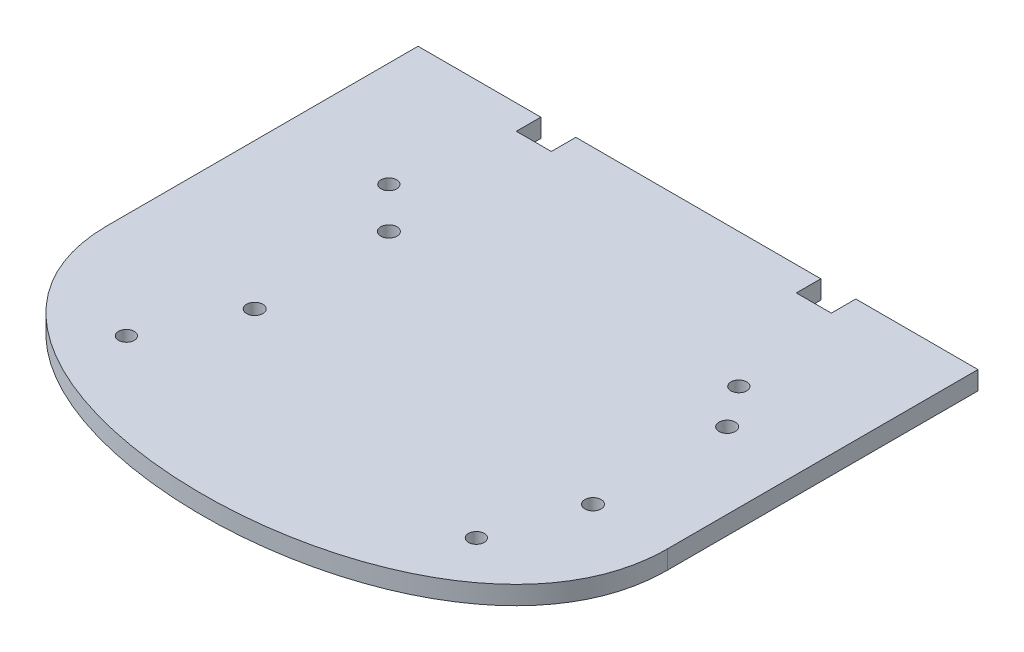
ISO-10303-21;
HEADER;
FILE_DESCRIPTION(('STEP AP214'),'2;1');
FILE_NAME('part.step','',(''),(''),'','','');
FILE_SCHEMA(('AUTOMOTIVE_DESIGN { 1 0 10303 214 1 1 1 1 }'));
ENDSEC;
DATA;
#1=APPLICATION_CONTEXT('core data for automotive mechanical design processes');
#2=APPLICATION_PROTOCOL_DEFINITION('international standard','automotive_design',2000,#1);
#3=PRODUCT_CONTEXT('',#1,'mechanical');
#4=PRODUCT('Part','Part','',(#3));
#5=PRODUCT_RELATED_PRODUCT_CATEGORY('part','',(#4));
#6=PRODUCT_DEFINITION_FORMATION('','',#4);
#7=PRODUCT_DEFINITION_CONTEXT('part definition',#1,'design');
#8=PRODUCT_DEFINITION('design','',#6,#7);
#9=PRODUCT_DEFINITION_SHAPE('','',#8);
#10=(LENGTH_UNIT() NAMED_UNIT(*) SI_UNIT(.MILLI.,.METRE.));
#11=(NAMED_UNIT(*) PLANE_ANGLE_UNIT() SI_UNIT($,.RADIAN.));
#12=(NAMED_UNIT(*) SI_UNIT($,.STERADIAN.) SOLID_ANGLE_UNIT());
#13=UNCERTAINTY_MEASURE_WITH_UNIT(LENGTH_MEASURE(1.E-05),#10,'distance_accuracy_value','');
#14=(GEOMETRIC_REPRESENTATION_CONTEXT(3) GLOBAL_UNCERTAINTY_ASSIGNED_CONTEXT((#13)) GLOBAL_UNIT_ASSIGNED_CONTEXT((#10,
#11,#12)) REPRESENTATION_CONTEXT('',''));
#15=CARTESIAN_POINT('',(0.,0.,0.));
#16=DIRECTION('',(0.,0.,1.));
#17=DIRECTION('',(1.,0.,0.));
#18=AXIS2_PLACEMENT_3D('',#15,#16,#17);
#19=CARTESIAN_POINT('',(48.,3.175,-42.5));
#20=DIRECTION('',(0.,0.,1.));
#21=DIRECTION('',(1.,0.,0.));
#22=AXIS2_PLACEMENT_3D('',#19,#20,#21);
#23=PLANE('',#22);
#24=DIRECTION('',(-1.,0.,0.));
#25=VECTOR('',#24,1.);
#26=CARTESIAN_POINT('',(48.,3.175,-42.5));
#27=LINE('',#26,#25);
#28=CARTESIAN_POINT('',(21.051144598735,3.175,-42.5));
#29=VERTEX_POINT('',#28);
#30=CARTESIAN_POINT('',(-20.948855401265,3.175,-42.4999999999998));
#31=VERTEX_POINT('',#30);
#32=EDGE_CURVE('E368',#29,#31,#27,.T.);
#33=ORIENTED_EDGE('',*,*,#32,.F.);
#34=DIRECTION('',(0.,1.,0.));
#35=VECTOR('',#34,1.);
#36=CARTESIAN_POINT('',(21.051144598735,0.,-42.5));
#37=LINE('',#36,#35);
#38=CARTESIAN_POINT('',(21.051144598735,0.,-42.5));
#39=VERTEX_POINT('',#38);
#40=EDGE_CURVE('E167',#39,#29,#37,.T.);
#41=ORIENTED_EDGE('',*,*,#40,.F.);
#42=DIRECTION('',(-1.,0.,0.));
#43=VECTOR('',#42,1.);
#44=CARTESIAN_POINT('',(48.,0.,-42.5));
#45=LINE('',#44,#43);
#46=CARTESIAN_POINT('',(-20.948855401265,0.,-42.4999999999998));
#47=VERTEX_POINT('',#46);
#48=EDGE_CURVE('E152',#39,#47,#45,.T.);
#49=ORIENTED_EDGE('',*,*,#48,.T.);
#50=DIRECTION('',(0.,1.,0.));
#51=VECTOR('',#50,1.);
#52=CARTESIAN_POINT('',(-20.948855401265,0.,-42.4999999999998));
#53=LINE('',#52,#51);
#54=EDGE_CURVE('E201',#47,#31,#53,.T.);
#55=ORIENTED_EDGE('',*,*,#54,.T.);
#56=EDGE_LOOP('',(#33,#41,#49,#55));
#57=FACE_BOUND('',#56,.T.);
#58=ADVANCED_FACE('F39',(#57),#23,.F.);
#59=CARTESIAN_POINT('',(-26.948855401265,3.175,-42.4999999999998));
#60=VERTEX_POINT('',#59);
#61=CARTESIAN_POINT('',(-48.,3.175,-42.5));
#62=VERTEX_POINT('',#61);
#63=EDGE_CURVE('E373',#60,#62,#27,.T.);
#64=ORIENTED_EDGE('',*,*,#63,.F.);
#65=DIRECTION('',(0.,1.,0.));
#66=VECTOR('',#65,1.);
#67=CARTESIAN_POINT('',(-26.948855401265,0.,-42.4999999999998));
#68=LINE('',#67,#66);
#69=CARTESIAN_POINT('',(-26.948855401265,0.,-42.4999999999998));
#70=VERTEX_POINT('',#69);
#71=EDGE_CURVE('E164',#70,#60,#68,.T.);
#72=ORIENTED_EDGE('',*,*,#71,.F.);
#73=CARTESIAN_POINT('',(-48.,0.,-42.5));
#74=VERTEX_POINT('',#73);
#75=EDGE_CURVE('E393',#70,#74,#45,.T.);
#76=ORIENTED_EDGE('',*,*,#75,.T.);
#77=DIRECTION('',(0.,-1.,0.));
#78=VECTOR('',#77,1.);
#79=CARTESIAN_POINT('',(-48.,3.175,-42.5));
#80=LINE('',#79,#78);
#81=EDGE_CURVE('E377',#62,#74,#80,.T.);
#82=ORIENTED_EDGE('',*,*,#81,.F.);
#83=EDGE_LOOP('',(#64,#72,#76,#82));
#84=FACE_BOUND('',#83,.T.);
#85=ADVANCED_FACE('F303',(#84),#23,.F.);
#86=CARTESIAN_POINT('',(-48.,3.175,-42.5));
#87=DIRECTION('',(1.,0.,0.));
#88=DIRECTION('',(0.,0.,-1.));
#89=AXIS2_PLACEMENT_3D('',#86,#87,#88);
#90=PLANE('',#89);
#91=DIRECTION('',(0.,0.,1.));
#92=VECTOR('',#91,1.);
#93=CARTESIAN_POINT('',(-48.,0.,-42.5));
#94=LINE('',#93,#92);
#95=CARTESIAN_POINT('',(-48.,0.,10.75));
#96=VERTEX_POINT('',#95);
#97=EDGE_CURVE('E273',#74,#96,#94,.T.);
#98=ORIENTED_EDGE('',*,*,#97,.T.);
#99=DIRECTION('',(0.,-1.,0.));
#100=VECTOR('',#99,1.);
#101=CARTESIAN_POINT('',(-48.,3.175,10.75));
#102=LINE('',#101,#100);
#103=CARTESIAN_POINT('',(-48.,3.175,10.75));
#104=VERTEX_POINT('',#103);
#105=EDGE_CURVE('E11',#104,#96,#102,.T.);
#106=ORIENTED_EDGE('',*,*,#105,.F.);
#107=DIRECTION('',(0.,0.,1.));
#108=VECTOR('',#107,1.);
#109=CARTESIAN_POINT('',(-48.,3.175,-42.5));
#110=LINE('',#109,#108);
#111=EDGE_CURVE('E274',#62,#104,#110,.T.);
#112=ORIENTED_EDGE('',*,*,#111,.F.);
#113=ORIENTED_EDGE('',*,*,#81,.T.);
#114=EDGE_LOOP('',(#98,#106,#112,#113));
#115=FACE_BOUND('',#114,.T.);
#116=ADVANCED_FACE('F41',(#115),#90,.F.);
#117=CARTESIAN_POINT('',(-48.,3.175,10.75));
#118=CARTESIAN_POINT('',(-48.,3.175,53.0833333333333));
#119=CARTESIAN_POINT('',(48.0000000000003,3.175,53.0833333333333));
#120=CARTESIAN_POINT('',(48.,3.175,10.75));
#121=B_SPLINE_CURVE_WITH_KNOTS('',3,(#117,#118,#119,#120),.UNSPECIFIED.,.F.,.F.,(4,4),(0.,1.),.UNSPECIFIED.);
#122=DIRECTION('',(0.,-1.,0.));
#123=VECTOR('',#122,1.);
#124=SURFACE_OF_LINEAR_EXTRUSION('',#121,#123);
#125=CARTESIAN_POINT('',(-48.,0.,10.75));
#126=CARTESIAN_POINT('',(-48.,0.,53.0833333333333));
#127=CARTESIAN_POINT('',(48.0000000000003,0.,53.0833333333333));
#128=CARTESIAN_POINT('',(48.,0.,10.75));
#129=B_SPLINE_CURVE_WITH_KNOTS('',3,(#125,#126,#127,#128),.UNSPECIFIED.,.F.,.F.,(4,4),(0.,1.),.UNSPECIFIED.);
#130=CARTESIAN_POINT('',(48.,0.,10.75));
#131=VERTEX_POINT('',#130);
#132=EDGE_CURVE('E382',#96,#131,#129,.T.);
#133=ORIENTED_EDGE('',*,*,#132,.T.);
#134=DIRECTION('',(0.,-1.,0.));
#135=VECTOR('',#134,1.);
#136=CARTESIAN_POINT('',(48.,3.175,10.75));
#137=LINE('',#136,#135);
#138=CARTESIAN_POINT('',(48.,3.175,10.75));
#139=VERTEX_POINT('',#138);
#140=EDGE_CURVE('E48',#139,#131,#137,.T.);
#141=ORIENTED_EDGE('',*,*,#140,.F.);
#142=EDGE_CURVE('E278',#104,#139,#121,.T.);
#143=ORIENTED_EDGE('',*,*,#142,.F.);
#144=ORIENTED_EDGE('',*,*,#105,.T.);
#145=EDGE_LOOP('',(#133,#141,#143,#144));
#146=FACE_BOUND('',#145,.T.);
#147=ADVANCED_FACE('F290',(#146),#124,.F.);
#148=CARTESIAN_POINT('',(48.,3.175,-42.5));
#149=DIRECTION('',(-1.,0.,0.));
#150=DIRECTION('',(0.,0.,1.));
#151=AXIS2_PLACEMENT_3D('',#148,#149,#150);
#152=PLANE('',#151);
#153=DIRECTION('',(0.,0.,-1.));
#154=VECTOR('',#153,1.);
#155=CARTESIAN_POINT('',(48.,0.,-42.5));
#156=LINE('',#155,#154);
#157=CARTESIAN_POINT('',(48.,0.,-42.5));
#158=VERTEX_POINT('',#157);
#159=EDGE_CURVE('E387',#131,#158,#156,.T.);
#160=ORIENTED_EDGE('',*,*,#159,.T.);
#161=DIRECTION('',(0.,-1.,0.));
#162=VECTOR('',#161,1.);
#163=CARTESIAN_POINT('',(48.,3.175,-42.5));
#164=LINE('',#163,#162);
#165=CARTESIAN_POINT('',(48.,3.175,-42.5));
#166=VERTEX_POINT('',#165);
#167=EDGE_CURVE('E400',#166,#158,#164,.T.);
#168=ORIENTED_EDGE('',*,*,#167,.F.);
#169=DIRECTION('',(0.,0.,-1.));
#170=VECTOR('',#169,1.);
#171=CARTESIAN_POINT('',(48.,3.175,-42.5));
#172=LINE('',#171,#170);
#173=EDGE_CURVE('E285',#139,#166,#172,.T.);
#174=ORIENTED_EDGE('',*,*,#173,.F.);
#175=ORIENTED_EDGE('',*,*,#140,.T.);
#176=EDGE_LOOP('',(#160,#168,#174,#175));
#177=FACE_BOUND('',#176,.T.);
#178=ADVANCED_FACE('F293',(#177),#152,.F.);
#179=CARTESIAN_POINT('',(27.051144598735,0.,-42.5));
#180=VERTEX_POINT('',#179);
#181=EDGE_CURVE('E279',#158,#180,#45,.T.);
#182=ORIENTED_EDGE('',*,*,#181,.T.);
#183=DIRECTION('',(0.,1.,0.));
#184=VECTOR('',#183,1.);
#185=CARTESIAN_POINT('',(27.051144598735,0.,-42.5));
#186=LINE('',#185,#184);
#187=CARTESIAN_POINT('',(27.051144598735,3.175,-42.5));
#188=VERTEX_POINT('',#187);
#189=EDGE_CURVE('E171',#180,#188,#186,.T.);
#190=ORIENTED_EDGE('',*,*,#189,.T.);
#191=EDGE_CURVE('E372',#166,#188,#27,.T.);
#192=ORIENTED_EDGE('',*,*,#191,.F.);
#193=ORIENTED_EDGE('',*,*,#167,.T.);
#194=EDGE_LOOP('',(#182,#190,#192,#193));
#195=FACE_BOUND('',#194,.T.);
#196=ADVANCED_FACE('F297',(#195),#23,.F.);
#197=CARTESIAN_POINT('',(1.196959198424E-13,3.175,42.5));
#198=DIRECTION('',(0.,-1.,0.));
#199=DIRECTION('',(0.,0.,-1.));
#200=AXIS2_PLACEMENT_3D('',#197,#198,#199);
#201=PLANE('',#200);
#202=CARTESIAN_POINT('',(-23.,3.175,10.5));
#203=DIRECTION('',(0.,-1.,0.));
#204=DIRECTION('',(0.,0.,-1.));
#205=AXIS2_PLACEMENT_3D('',#202,#203,#204);
#206=CIRCLE('',#205,1.397);
#207=CARTESIAN_POINT('',(-23.,3.175,9.103));
#208=VERTEX_POINT('',#207);
#209=EDGE_CURVE('E269',#208,#208,#206,.T.);
#210=ORIENTED_EDGE('',*,*,#209,.T.);
#211=EDGE_LOOP('',(#210));
#212=FACE_BOUND('',#211,.T.);
#213=CARTESIAN_POINT('',(35.,3.175,10.5));
#214=DIRECTION('',(0.,-1.,0.));
#215=DIRECTION('',(0.,0.,-1.));
#216=AXIS2_PLACEMENT_3D('',#213,#214,#215);
#217=CIRCLE('',#216,1.397);
#218=CARTESIAN_POINT('',(35.,3.175,9.103));
#219=VERTEX_POINT('',#218);
#220=EDGE_CURVE('E265',#219,#219,#217,.T.);
#221=ORIENTED_EDGE('',*,*,#220,.T.);
#222=EDGE_LOOP('',(#221));
#223=FACE_BOUND('',#222,.T.);
#224=CARTESIAN_POINT('',(35.,3.175,-12.5));
#225=DIRECTION('',(0.,-1.,0.));
#226=DIRECTION('',(0.,0.,-1.));
#227=AXIS2_PLACEMENT_3D('',#224,#225,#226);
#228=CIRCLE('',#227,1.397);
#229=CARTESIAN_POINT('',(35.,3.175,-13.897));
#230=VERTEX_POINT('',#229);
#231=EDGE_CURVE('E261',#230,#230,#228,.T.);
#232=ORIENTED_EDGE('',*,*,#231,.T.);
#233=EDGE_LOOP('',(#232));
#234=FACE_BOUND('',#233,.T.);
#235=CARTESIAN_POINT('',(-30.,3.175,-19.5));
#236=DIRECTION('',(0.,-1.,0.));
#237=DIRECTION('',(0.,0.,-1.));
#238=AXIS2_PLACEMENT_3D('',#235,#236,#237);
#239=CIRCLE('',#238,1.35);
#240=CARTESIAN_POINT('',(-30.,3.175,-20.85));
#241=VERTEX_POINT('',#240);
#242=EDGE_CURVE('E257',#241,#241,#239,.T.);
#243=ORIENTED_EDGE('',*,*,#242,.T.);
#244=EDGE_LOOP('',(#243));
#245=FACE_BOUND('',#244,.T.);
#246=CARTESIAN_POINT('',(-30.,3.175,25.5));
#247=DIRECTION('',(0.,-1.,0.));
#248=DIRECTION('',(0.,0.,-1.));
#249=AXIS2_PLACEMENT_3D('',#246,#247,#248);
#250=CIRCLE('',#249,1.35000000000001);
#251=CARTESIAN_POINT('',(-30.,3.175,24.15));
#252=VERTEX_POINT('',#251);
#253=EDGE_CURVE('E253',#252,#252,#250,.T.);
#254=ORIENTED_EDGE('',*,*,#253,.T.);
#255=EDGE_LOOP('',(#254));
#256=FACE_BOUND('',#255,.T.);
#257=CARTESIAN_POINT('',(30.,3.175,25.5));
#258=DIRECTION('',(0.,-1.,0.));
#259=DIRECTION('',(0.,0.,-1.));
#260=AXIS2_PLACEMENT_3D('',#257,#258,#259);
#261=CIRCLE('',#260,1.35000000000001);
#262=CARTESIAN_POINT('',(30.,3.175,24.15));
#263=VERTEX_POINT('',#262);
#264=EDGE_CURVE('E249',#263,#263,#261,.T.);
#265=ORIENTED_EDGE('',*,*,#264,.T.);
#266=EDGE_LOOP('',(#265));
#267=FACE_BOUND('',#266,.T.);
#268=CARTESIAN_POINT('',(30.,3.175,-19.5));
#269=DIRECTION('',(0.,-1.,0.));
#270=DIRECTION('',(0.,0.,-1.));
#271=AXIS2_PLACEMENT_3D('',#268,#269,#270);
#272=CIRCLE('',#271,1.35);
#273=CARTESIAN_POINT('',(30.,3.175,-20.85));
#274=VERTEX_POINT('',#273);
#275=EDGE_CURVE('E245',#274,#274,#272,.T.);
#276=ORIENTED_EDGE('',*,*,#275,.T.);
#277=EDGE_LOOP('',(#276));
#278=FACE_BOUND('',#277,.T.);
#279=CARTESIAN_POINT('',(-23.,3.175,-12.5));
#280=DIRECTION('',(0.,-1.,0.));
#281=DIRECTION('',(0.,0.,-1.));
#282=AXIS2_PLACEMENT_3D('',#279,#280,#281);
#283=CIRCLE('',#282,1.397);
#284=CARTESIAN_POINT('',(-23.,3.175,-13.897));
#285=VERTEX_POINT('',#284);
#286=EDGE_CURVE('E241',#285,#285,#283,.T.);
#287=ORIENTED_EDGE('',*,*,#286,.T.);
#288=EDGE_LOOP('',(#287));
#289=FACE_BOUND('',#288,.T.);
#290=DIRECTION('',(1.,0.,0.));
#291=VECTOR('',#290,1.);
#292=CARTESIAN_POINT('',(21.051144598735,3.175,-38.3));
#293=LINE('',#292,#291);
#294=CARTESIAN_POINT('',(21.051144598735,3.175,-38.3));
#295=VERTEX_POINT('',#294);
#296=CARTESIAN_POINT('',(27.051144598735,3.175,-38.3));
#297=VERTEX_POINT('',#296);
#298=EDGE_CURVE('E157',#295,#297,#293,.T.);
#299=ORIENTED_EDGE('',*,*,#298,.F.);
#300=DIRECTION('',(0.,0.,1.));
#301=VECTOR('',#300,1.);
#302=CARTESIAN_POINT('',(21.051144598735,3.175,-42.5));
#303=LINE('',#302,#301);
#304=EDGE_CURVE('E135',#29,#295,#303,.T.);
#305=ORIENTED_EDGE('',*,*,#304,.F.);
#306=ORIENTED_EDGE('',*,*,#32,.T.);
#307=DIRECTION('',(0.,0.,-1.));
#308=VECTOR('',#307,1.);
#309=CARTESIAN_POINT('',(-20.948855401265,3.175,-42.4999999999998));
#310=LINE('',#309,#308);
#311=CARTESIAN_POINT('',(-20.948855401265,3.175,-38.2999999999998));
#312=VERTEX_POINT('',#311);
#313=EDGE_CURVE('E182',#312,#31,#310,.T.);
#314=ORIENTED_EDGE('',*,*,#313,.F.);
#315=DIRECTION('',(1.,0.,0.));
#316=VECTOR('',#315,1.);
#317=CARTESIAN_POINT('',(-26.948855401265,3.175,-38.2999999999998));
#318=LINE('',#317,#316);
#319=CARTESIAN_POINT('',(-26.948855401265,3.175,-38.2999999999998));
#320=VERTEX_POINT('',#319);
#321=EDGE_CURVE('E193',#320,#312,#318,.T.);
#322=ORIENTED_EDGE('',*,*,#321,.F.);
#323=DIRECTION('',(0.,0.,1.));
#324=VECTOR('',#323,1.);
#325=CARTESIAN_POINT('',(-26.948855401265,3.175,-42.4999999999998));
#326=LINE('',#325,#324);
#327=EDGE_CURVE('E189',#60,#320,#326,.T.);
#328=ORIENTED_EDGE('',*,*,#327,.F.);
#329=ORIENTED_EDGE('',*,*,#63,.T.);
#330=ORIENTED_EDGE('',*,*,#111,.T.);
#331=ORIENTED_EDGE('',*,*,#142,.T.);
#332=ORIENTED_EDGE('',*,*,#173,.T.);
#333=ORIENTED_EDGE('',*,*,#191,.T.);
#334=DIRECTION('',(0.,0.,-1.));
#335=VECTOR('',#334,1.);
#336=CARTESIAN_POINT('',(27.051144598735,3.175,-42.5));
#337=LINE('',#336,#335);
#338=EDGE_CURVE('E154',#297,#188,#337,.T.);
#339=ORIENTED_EDGE('',*,*,#338,.F.);
#340=EDGE_LOOP('',(#299,#305,#306,#314,#322,#328,#329,#330,#331,#332,#333,#339));
#341=FACE_BOUND('',#340,.T.);
#342=ADVANCED_FACE('F301',(#212,#223,#234,#245,#256,#267,#278,#289,#341),#201,.F.);
#343=CARTESIAN_POINT('',(1.196959198424E-13,0.,42.5));
#344=DIRECTION('',(0.,-1.,0.));
#345=DIRECTION('',(0.,0.,-1.));
#346=AXIS2_PLACEMENT_3D('',#343,#344,#345);
#347=PLANE('',#346);
#348=DIRECTION('',(0.,0.,1.));
#349=VECTOR('',#348,1.);
#350=CARTESIAN_POINT('',(21.051144598735,0.,-42.5));
#351=LINE('',#350,#349);
#352=CARTESIAN_POINT('',(21.051144598735,0.,-38.3));
#353=VERTEX_POINT('',#352);
#354=EDGE_CURVE('E132',#39,#353,#351,.T.);
#355=ORIENTED_EDGE('',*,*,#354,.T.);
#356=DIRECTION('',(1.,0.,0.));
#357=VECTOR('',#356,1.);
#358=CARTESIAN_POINT('',(21.051144598735,0.,-38.3));
#359=LINE('',#358,#357);
#360=CARTESIAN_POINT('',(27.051144598735,0.,-38.3));
#361=VERTEX_POINT('',#360);
#362=EDGE_CURVE('E143',#353,#361,#359,.T.);
#363=ORIENTED_EDGE('',*,*,#362,.T.);
#364=DIRECTION('',(0.,0.,-1.));
#365=VECTOR('',#364,1.);
#366=CARTESIAN_POINT('',(27.051144598735,0.,-42.5));
#367=LINE('',#366,#365);
#368=EDGE_CURVE('E55',#361,#180,#367,.T.);
#369=ORIENTED_EDGE('',*,*,#368,.T.);
#370=ORIENTED_EDGE('',*,*,#181,.F.);
#371=ORIENTED_EDGE('',*,*,#159,.F.);
#372=ORIENTED_EDGE('',*,*,#132,.F.);
#373=ORIENTED_EDGE('',*,*,#97,.F.);
#374=ORIENTED_EDGE('',*,*,#75,.F.);
#375=DIRECTION('',(0.,0.,1.));
#376=VECTOR('',#375,1.);
#377=CARTESIAN_POINT('',(-26.948855401265,0.,-42.4999999999998));
#378=LINE('',#377,#376);
#379=CARTESIAN_POINT('',(-26.948855401265,0.,-38.2999999999998));
#380=VERTEX_POINT('',#379);
#381=EDGE_CURVE('E177',#70,#380,#378,.T.);
#382=ORIENTED_EDGE('',*,*,#381,.T.);
#383=DIRECTION('',(1.,0.,0.));
#384=VECTOR('',#383,1.);
#385=CARTESIAN_POINT('',(-26.948855401265,0.,-38.2999999999998));
#386=LINE('',#385,#384);
#387=CARTESIAN_POINT('',(-20.948855401265,0.,-38.2999999999998));
#388=VERTEX_POINT('',#387);
#389=EDGE_CURVE('E181',#380,#388,#386,.T.);
#390=ORIENTED_EDGE('',*,*,#389,.T.);
#391=DIRECTION('',(0.,0.,-1.));
#392=VECTOR('',#391,1.);
#393=CARTESIAN_POINT('',(-20.948855401265,0.,-42.4999999999998));
#394=LINE('',#393,#392);
#395=EDGE_CURVE('E63',#388,#47,#394,.T.);
#396=ORIENTED_EDGE('',*,*,#395,.T.);
#397=ORIENTED_EDGE('',*,*,#48,.F.);
#398=EDGE_LOOP('',(#355,#363,#369,#370,#371,#372,#373,#374,#382,#390,#396,#397));
#399=FACE_BOUND('',#398,.T.);
#400=CARTESIAN_POINT('',(-23.,0.,10.5));
#401=DIRECTION('',(0.,1.,0.));
#402=DIRECTION('',(0.,0.,1.));
#403=AXIS2_PLACEMENT_3D('',#400,#401,#402);
#404=CIRCLE('',#403,1.397);
#405=CARTESIAN_POINT('',(-23.,0.,11.897));
#406=VERTEX_POINT('',#405);
#407=EDGE_CURVE('E222',#406,#406,#404,.T.);
#408=ORIENTED_EDGE('',*,*,#407,.T.);
#409=EDGE_LOOP('',(#408));
#410=FACE_BOUND('',#409,.T.);
#411=CARTESIAN_POINT('',(35.,0.,10.5));
#412=DIRECTION('',(0.,1.,0.));
#413=DIRECTION('',(0.,0.,-1.));
#414=AXIS2_PLACEMENT_3D('',#411,#412,#413);
#415=CIRCLE('',#414,1.397);
#416=CARTESIAN_POINT('',(35.,0.,9.103));
#417=VERTEX_POINT('',#416);
#418=EDGE_CURVE('E227',#417,#417,#415,.T.);
#419=ORIENTED_EDGE('',*,*,#418,.T.);
#420=EDGE_LOOP('',(#419));
#421=FACE_BOUND('',#420,.T.);
#422=CARTESIAN_POINT('',(35.,0.,-12.5));
#423=DIRECTION('',(0.,1.,0.));
#424=DIRECTION('',(0.,0.,-1.));
#425=AXIS2_PLACEMENT_3D('',#422,#423,#424);
#426=CIRCLE('',#425,1.397);
#427=CARTESIAN_POINT('',(35.,0.,-13.897));
#428=VERTEX_POINT('',#427);
#429=EDGE_CURVE('E231',#428,#428,#426,.T.);
#430=ORIENTED_EDGE('',*,*,#429,.T.);
#431=EDGE_LOOP('',(#430));
#432=FACE_BOUND('',#431,.T.);
#433=CARTESIAN_POINT('',(-30.,0.,-19.5));
#434=DIRECTION('',(0.,1.,0.));
#435=DIRECTION('',(0.,0.,1.));
#436=AXIS2_PLACEMENT_3D('',#433,#434,#435);
#437=CIRCLE('',#436,1.35);
#438=CARTESIAN_POINT('',(-30.,0.,-18.15));
#439=VERTEX_POINT('',#438);
#440=EDGE_CURVE('E214',#439,#439,#437,.T.);
#441=ORIENTED_EDGE('',*,*,#440,.T.);
#442=EDGE_LOOP('',(#441));
#443=FACE_BOUND('',#442,.T.);
#444=CARTESIAN_POINT('',(-30.,0.,25.5));
#445=DIRECTION('',(0.,1.,0.));
#446=DIRECTION('',(0.,0.,1.));
#447=AXIS2_PLACEMENT_3D('',#444,#445,#446);
#448=CIRCLE('',#447,1.35000000000001);
#449=CARTESIAN_POINT('',(-30.,0.,26.85));
#450=VERTEX_POINT('',#449);
#451=EDGE_CURVE('E210',#450,#450,#448,.T.);
#452=ORIENTED_EDGE('',*,*,#451,.T.);
#453=EDGE_LOOP('',(#452));
#454=FACE_BOUND('',#453,.T.);
#455=CARTESIAN_POINT('',(30.,0.,25.5));
#456=DIRECTION('',(0.,1.,0.));
#457=DIRECTION('',(0.,0.,-1.));
#458=AXIS2_PLACEMENT_3D('',#455,#456,#457);
#459=CIRCLE('',#458,1.35000000000001);
#460=CARTESIAN_POINT('',(30.,0.,24.15));
#461=VERTEX_POINT('',#460);
#462=EDGE_CURVE('E215',#461,#461,#459,.T.);
#463=ORIENTED_EDGE('',*,*,#462,.T.);
#464=EDGE_LOOP('',(#463));
#465=FACE_BOUND('',#464,.T.);
#466=CARTESIAN_POINT('',(30.,0.,-19.5));
#467=DIRECTION('',(0.,1.,0.));
#468=DIRECTION('',(0.,0.,-1.));
#469=AXIS2_PLACEMENT_3D('',#466,#467,#468);
#470=CIRCLE('',#469,1.35);
#471=CARTESIAN_POINT('',(30.,0.,-20.85));
#472=VERTEX_POINT('',#471);
#473=EDGE_CURVE('E170',#472,#472,#470,.T.);
#474=ORIENTED_EDGE('',*,*,#473,.T.);
#475=EDGE_LOOP('',(#474));
#476=FACE_BOUND('',#475,.T.);
#477=CARTESIAN_POINT('',(-23.,0.,-12.5));
#478=DIRECTION('',(0.,1.,0.));
#479=DIRECTION('',(0.,0.,1.));
#480=AXIS2_PLACEMENT_3D('',#477,#478,#479);
#481=CIRCLE('',#480,1.397);
#482=CARTESIAN_POINT('',(-23.,0.,-11.103));
#483=VERTEX_POINT('',#482);
#484=EDGE_CURVE('E226',#483,#483,#481,.T.);
#485=ORIENTED_EDGE('',*,*,#484,.T.);
#486=EDGE_LOOP('',(#485));
#487=FACE_BOUND('',#486,.T.);
#488=ADVANCED_FACE('F149',(#399,#410,#421,#432,#443,#454,#465,#476,#487),#347,.T.);
#489=CARTESIAN_POINT('',(-23.,0.,-12.5));
#490=DIRECTION('',(0.,1.,0.));
#491=DIRECTION('',(0.,0.,1.));
#492=AXIS2_PLACEMENT_3D('',#489,#490,#491);
#493=CYLINDRICAL_SURFACE('',#492,1.397);
#494=ORIENTED_EDGE('',*,*,#484,.F.);
#495=EDGE_LOOP('',(#494));
#496=FACE_BOUND('',#495,.T.);
#497=ORIENTED_EDGE('',*,*,#286,.F.);
#498=EDGE_LOOP('',(#497));
#499=FACE_BOUND('',#498,.T.);
#500=ADVANCED_FACE('F306',(#496,#499),#493,.F.);
#501=CARTESIAN_POINT('',(30.,0.,-19.5));
#502=DIRECTION('',(0.,1.,0.));
#503=DIRECTION('',(0.,0.,1.));
#504=AXIS2_PLACEMENT_3D('',#501,#502,#503);
#505=CYLINDRICAL_SURFACE('',#504,1.35);
#506=ORIENTED_EDGE('',*,*,#473,.F.);
#507=EDGE_LOOP('',(#506));
#508=FACE_BOUND('',#507,.T.);
#509=ORIENTED_EDGE('',*,*,#275,.F.);
#510=EDGE_LOOP('',(#509));
#511=FACE_BOUND('',#510,.T.);
#512=ADVANCED_FACE('F312',(#508,#511),#505,.F.);
#513=CARTESIAN_POINT('',(30.,0.,25.5));
#514=DIRECTION('',(0.,1.,0.));
#515=DIRECTION('',(0.,0.,1.));
#516=AXIS2_PLACEMENT_3D('',#513,#514,#515);
#517=CYLINDRICAL_SURFACE('',#516,1.35000000000001);
#518=ORIENTED_EDGE('',*,*,#462,.F.);
#519=EDGE_LOOP('',(#518));
#520=FACE_BOUND('',#519,.T.);
#521=ORIENTED_EDGE('',*,*,#264,.F.);
#522=EDGE_LOOP('',(#521));
#523=FACE_BOUND('',#522,.T.);
#524=ADVANCED_FACE('F334',(#520,#523),#517,.F.);
#525=CARTESIAN_POINT('',(-30.,0.,25.5));
#526=DIRECTION('',(0.,1.,0.));
#527=DIRECTION('',(0.,0.,1.));
#528=AXIS2_PLACEMENT_3D('',#525,#526,#527);
#529=CYLINDRICAL_SURFACE('',#528,1.35000000000001);
#530=ORIENTED_EDGE('',*,*,#451,.F.);
#531=EDGE_LOOP('',(#530));
#532=FACE_BOUND('',#531,.T.);
#533=ORIENTED_EDGE('',*,*,#253,.F.);
#534=EDGE_LOOP('',(#533));
#535=FACE_BOUND('',#534,.T.);
#536=ADVANCED_FACE('F318',(#532,#535),#529,.F.);
#537=CARTESIAN_POINT('',(-30.,0.,-19.5));
#538=DIRECTION('',(0.,1.,0.));
#539=DIRECTION('',(0.,0.,1.));
#540=AXIS2_PLACEMENT_3D('',#537,#538,#539);
#541=CYLINDRICAL_SURFACE('',#540,1.35);
#542=ORIENTED_EDGE('',*,*,#440,.F.);
#543=EDGE_LOOP('',(#542));
#544=FACE_BOUND('',#543,.T.);
#545=ORIENTED_EDGE('',*,*,#242,.F.);
#546=EDGE_LOOP('',(#545));
#547=FACE_BOUND('',#546,.T.);
#548=ADVANCED_FACE('F314',(#544,#547),#541,.F.);
#549=CARTESIAN_POINT('',(35.,0.,-12.5));
#550=DIRECTION('',(0.,1.,0.));
#551=DIRECTION('',(0.,0.,1.));
#552=AXIS2_PLACEMENT_3D('',#549,#550,#551);
#553=CYLINDRICAL_SURFACE('',#552,1.397);
#554=ORIENTED_EDGE('',*,*,#429,.F.);
#555=EDGE_LOOP('',(#554));
#556=FACE_BOUND('',#555,.T.);
#557=ORIENTED_EDGE('',*,*,#231,.F.);
#558=EDGE_LOOP('',(#557));
#559=FACE_BOUND('',#558,.T.);
#560=ADVANCED_FACE('F317',(#556,#559),#553,.F.);
#561=CARTESIAN_POINT('',(35.,0.,10.5));
#562=DIRECTION('',(0.,1.,0.));
#563=DIRECTION('',(0.,0.,1.));
#564=AXIS2_PLACEMENT_3D('',#561,#562,#563);
#565=CYLINDRICAL_SURFACE('',#564,1.397);
#566=ORIENTED_EDGE('',*,*,#418,.F.);
#567=EDGE_LOOP('',(#566));
#568=FACE_BOUND('',#567,.T.);
#569=ORIENTED_EDGE('',*,*,#220,.F.);
#570=EDGE_LOOP('',(#569));
#571=FACE_BOUND('',#570,.T.);
#572=ADVANCED_FACE('F322',(#568,#571),#565,.F.);
#573=CARTESIAN_POINT('',(-23.,0.,10.5));
#574=DIRECTION('',(0.,1.,0.));
#575=DIRECTION('',(0.,0.,1.));
#576=AXIS2_PLACEMENT_3D('',#573,#574,#575);
#577=CYLINDRICAL_SURFACE('',#576,1.397);
#578=ORIENTED_EDGE('',*,*,#407,.F.);
#579=EDGE_LOOP('',(#578));
#580=FACE_BOUND('',#579,.T.);
#581=ORIENTED_EDGE('',*,*,#209,.F.);
#582=EDGE_LOOP('',(#581));
#583=FACE_BOUND('',#582,.T.);
#584=ADVANCED_FACE('F326',(#580,#583),#577,.F.);
#585=CARTESIAN_POINT('',(-26.948855401265,0.,-42.4999999999998));
#586=DIRECTION('',(-1.,0.,0.));
#587=DIRECTION('',(0.,0.,1.));
#588=AXIS2_PLACEMENT_3D('',#585,#586,#587);
#589=PLANE('',#588);
#590=ORIENTED_EDGE('',*,*,#327,.T.);
#591=DIRECTION('',(0.,1.,0.));
#592=VECTOR('',#591,1.);
#593=CARTESIAN_POINT('',(-26.948855401265,0.,-38.2999999999998));
#594=LINE('',#593,#592);
#595=EDGE_CURVE('E188',#380,#320,#594,.T.);
#596=ORIENTED_EDGE('',*,*,#595,.F.);
#597=ORIENTED_EDGE('',*,*,#381,.F.);
#598=ORIENTED_EDGE('',*,*,#71,.T.);
#599=EDGE_LOOP('',(#590,#596,#597,#598));
#600=FACE_BOUND('',#599,.T.);
#601=ADVANCED_FACE('F330',(#600),#589,.F.);
#602=CARTESIAN_POINT('',(-20.948855401265,0.,-42.4999999999998));
#603=DIRECTION('',(1.,0.,0.));
#604=DIRECTION('',(0.,0.,-1.));
#605=AXIS2_PLACEMENT_3D('',#602,#603,#604);
#606=PLANE('',#605);
#607=ORIENTED_EDGE('',*,*,#313,.T.);
#608=ORIENTED_EDGE('',*,*,#54,.F.);
#609=ORIENTED_EDGE('',*,*,#395,.F.);
#610=DIRECTION('',(0.,1.,0.));
#611=VECTOR('',#610,1.);
#612=CARTESIAN_POINT('',(-20.948855401265,0.,-38.2999999999998));
#613=LINE('',#612,#611);
#614=EDGE_CURVE('E205',#388,#312,#613,.T.);
#615=ORIENTED_EDGE('',*,*,#614,.T.);
#616=EDGE_LOOP('',(#607,#608,#609,#615));
#617=FACE_BOUND('',#616,.T.);
#618=ADVANCED_FACE('F344',(#617),#606,.F.);
#619=CARTESIAN_POINT('',(-26.948855401265,0.,-38.2999999999998));
#620=DIRECTION('',(0.,0.,1.));
#621=DIRECTION('',(1.,0.,0.));
#622=AXIS2_PLACEMENT_3D('',#619,#620,#621);
#623=PLANE('',#622);
#624=ORIENTED_EDGE('',*,*,#321,.T.);
#625=ORIENTED_EDGE('',*,*,#614,.F.);
#626=ORIENTED_EDGE('',*,*,#389,.F.);
#627=ORIENTED_EDGE('',*,*,#595,.T.);
#628=EDGE_LOOP('',(#624,#625,#626,#627));
#629=FACE_BOUND('',#628,.T.);
#630=ADVANCED_FACE('F346',(#629),#623,.F.);
#631=CARTESIAN_POINT('',(21.051144598735,0.,-42.5));
#632=DIRECTION('',(-1.,0.,0.));
#633=DIRECTION('',(0.,0.,1.));
#634=AXIS2_PLACEMENT_3D('',#631,#632,#633);
#635=PLANE('',#634);
#636=ORIENTED_EDGE('',*,*,#304,.T.);
#637=DIRECTION('',(0.,1.,0.));
#638=VECTOR('',#637,1.);
#639=CARTESIAN_POINT('',(21.051144598735,0.,-38.3));
#640=LINE('',#639,#638);
#641=EDGE_CURVE('E128',#353,#295,#640,.T.);
#642=ORIENTED_EDGE('',*,*,#641,.F.);
#643=ORIENTED_EDGE('',*,*,#354,.F.);
#644=ORIENTED_EDGE('',*,*,#40,.T.);
#645=EDGE_LOOP('',(#636,#642,#643,#644));
#646=FACE_BOUND('',#645,.T.);
#647=ADVANCED_FACE('F130',(#646),#635,.F.);
#648=CARTESIAN_POINT('',(27.051144598735,0.,-42.5));
#649=DIRECTION('',(1.,0.,0.));
#650=DIRECTION('',(0.,0.,-1.));
#651=AXIS2_PLACEMENT_3D('',#648,#649,#650);
#652=PLANE('',#651);
#653=ORIENTED_EDGE('',*,*,#338,.T.);
#654=ORIENTED_EDGE('',*,*,#189,.F.);
#655=ORIENTED_EDGE('',*,*,#368,.F.);
#656=DIRECTION('',(0.,1.,0.));
#657=VECTOR('',#656,1.);
#658=CARTESIAN_POINT('',(27.051144598735,0.,-38.3));
#659=LINE('',#658,#657);
#660=EDGE_CURVE('E140',#361,#297,#659,.T.);
#661=ORIENTED_EDGE('',*,*,#660,.T.);
#662=EDGE_LOOP('',(#653,#654,#655,#661));
#663=FACE_BOUND('',#662,.T.);
#664=ADVANCED_FACE('F354',(#663),#652,.F.);
#665=CARTESIAN_POINT('',(21.051144598735,0.,-38.3));
#666=DIRECTION('',(0.,0.,1.));
#667=DIRECTION('',(1.,0.,0.));
#668=AXIS2_PLACEMENT_3D('',#665,#666,#667);
#669=PLANE('',#668);
#670=ORIENTED_EDGE('',*,*,#298,.T.);
#671=ORIENTED_EDGE('',*,*,#660,.F.);
#672=ORIENTED_EDGE('',*,*,#362,.F.);
#673=ORIENTED_EDGE('',*,*,#641,.T.);
#674=EDGE_LOOP('',(#670,#671,#672,#673));
#675=FACE_BOUND('',#674,.T.);
#676=ADVANCED_FACE('F144',(#675),#669,.F.);
#677=CLOSED_SHELL('',(#58,#85,#116,#147,#178,#196,#342,#488,#500,#512,#524,#536,#548,#560,#572,
#584,#601,#618,#630,#647,#664,#676));
#678=MANIFOLD_SOLID_BREP('B2',#677);
#679=ADVANCED_BREP_SHAPE_REPRESENTATION('',(#18,#678),#14);
#680=SHAPE_DEFINITION_REPRESENTATION(#9,#679);
ENDSEC;
END-ISO-10303-21;
